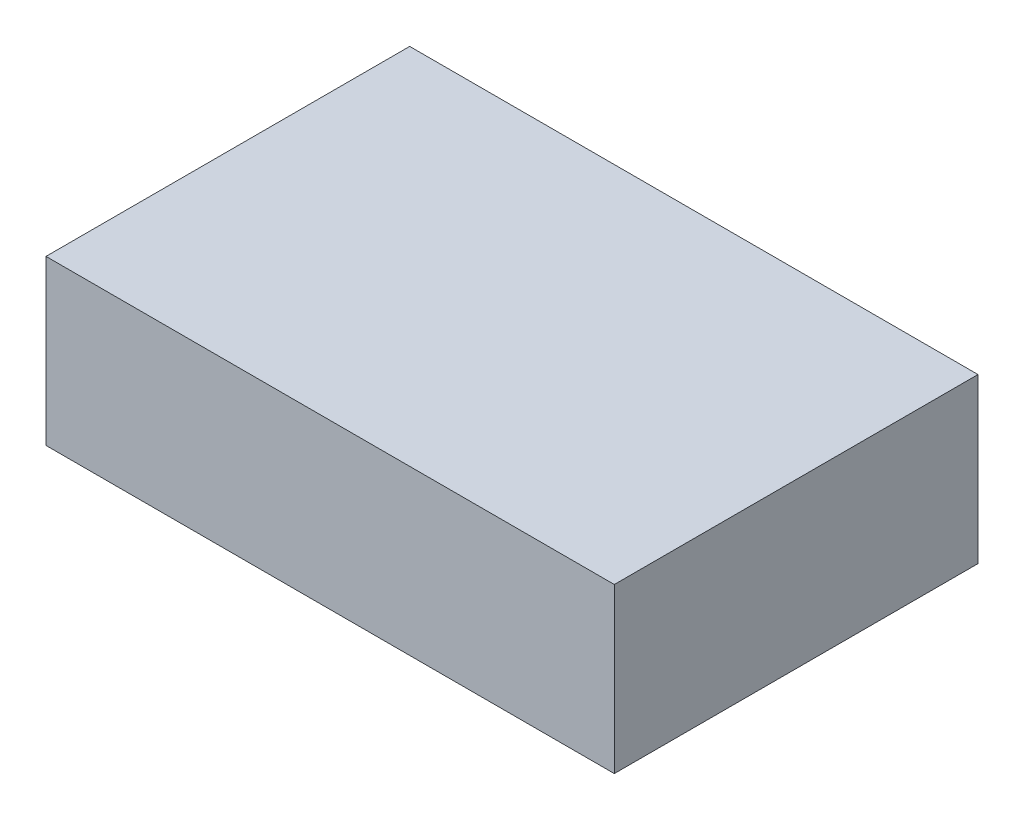
ISO-10303-21;
HEADER;
FILE_DESCRIPTION(('STEP AP214'),'2;1');
FILE_NAME('part.step','',(''),(''),'','','');
FILE_SCHEMA(('AUTOMOTIVE_DESIGN { 1 0 10303 214 1 1 1 1 }'));
ENDSEC;
DATA;
#1=APPLICATION_CONTEXT('core data for automotive mechanical design processes');
#2=APPLICATION_PROTOCOL_DEFINITION('international standard','automotive_design',2000,#1);
#3=PRODUCT_CONTEXT('',#1,'mechanical');
#4=PRODUCT('Part','Part','',(#3));
#5=PRODUCT_RELATED_PRODUCT_CATEGORY('part','',(#4));
#6=PRODUCT_DEFINITION_FORMATION('','',#4);
#7=PRODUCT_DEFINITION_CONTEXT('part definition',#1,'design');
#8=PRODUCT_DEFINITION('design','',#6,#7);
#9=PRODUCT_DEFINITION_SHAPE('','',#8);
#10=(LENGTH_UNIT() NAMED_UNIT(*) SI_UNIT(.MILLI.,.METRE.));
#11=(NAMED_UNIT(*) PLANE_ANGLE_UNIT() SI_UNIT($,.RADIAN.));
#12=(NAMED_UNIT(*) SI_UNIT($,.STERADIAN.) SOLID_ANGLE_UNIT());
#13=UNCERTAINTY_MEASURE_WITH_UNIT(LENGTH_MEASURE(1.E-05),#10,'distance_accuracy_value','');
#14=(GEOMETRIC_REPRESENTATION_CONTEXT(3) GLOBAL_UNCERTAINTY_ASSIGNED_CONTEXT((#13)) GLOBAL_UNIT_ASSIGNED_CONTEXT((#10,
#11,#12)) REPRESENTATION_CONTEXT('',''));
#15=CARTESIAN_POINT('',(0.,0.,0.));
#16=DIRECTION('',(0.,0.,1.));
#17=DIRECTION('',(1.,0.,0.));
#18=AXIS2_PLACEMENT_3D('',#15,#16,#17);
#19=CARTESIAN_POINT('',(0.,34.,0.));
#20=DIRECTION('',(1.,0.,0.));
#21=DIRECTION('',(0.,0.,-1.));
#22=AXIS2_PLACEMENT_3D('',#19,#20,#21);
#23=PLANE('',#22);
#24=DIRECTION('',(0.,0.,1.));
#25=VECTOR('',#24,1.);
#26=CARTESIAN_POINT('',(0.,0.,0.));
#27=LINE('',#26,#25);
#28=CARTESIAN_POINT('',(0.,0.,-75.5));
#29=VERTEX_POINT('',#28);
#30=CARTESIAN_POINT('',(0.,0.,0.));
#31=VERTEX_POINT('',#30);
#32=EDGE_CURVE('E106',#29,#31,#27,.T.);
#33=ORIENTED_EDGE('',*,*,#32,.T.);
#34=DIRECTION('',(0.,-1.,0.));
#35=VECTOR('',#34,1.);
#36=CARTESIAN_POINT('',(0.,34.,0.));
#37=LINE('',#36,#35);
#38=CARTESIAN_POINT('',(0.,34.,0.));
#39=VERTEX_POINT('',#38);
#40=EDGE_CURVE('E11',#39,#31,#37,.T.);
#41=ORIENTED_EDGE('',*,*,#40,.F.);
#42=DIRECTION('',(0.,0.,1.));
#43=VECTOR('',#42,1.);
#44=CARTESIAN_POINT('',(0.,34.,0.));
#45=LINE('',#44,#43);
#46=CARTESIAN_POINT('',(0.,34.,-75.5));
#47=VERTEX_POINT('',#46);
#48=EDGE_CURVE('E94',#47,#39,#45,.T.);
#49=ORIENTED_EDGE('',*,*,#48,.F.);
#50=DIRECTION('',(0.,-1.,0.));
#51=VECTOR('',#50,1.);
#52=CARTESIAN_POINT('',(0.,34.,-75.5));
#53=LINE('',#52,#51);
#54=EDGE_CURVE('E102',#47,#29,#53,.T.);
#55=ORIENTED_EDGE('',*,*,#54,.T.);
#56=EDGE_LOOP('',(#33,#41,#49,#55));
#57=FACE_BOUND('',#56,.T.);
#58=ADVANCED_FACE('F43',(#57),#23,.F.);
#59=CARTESIAN_POINT('',(0.,34.,0.));
#60=DIRECTION('',(0.,0.,-1.));
#61=DIRECTION('',(-1.,0.,0.));
#62=AXIS2_PLACEMENT_3D('',#59,#60,#61);
#63=PLANE('',#62);
#64=DIRECTION('',(1.,0.,0.));
#65=VECTOR('',#64,1.);
#66=CARTESIAN_POINT('',(0.,0.,0.));
#67=LINE('',#66,#65);
#68=CARTESIAN_POINT('',(117.983,0.,0.));
#69=VERTEX_POINT('',#68);
#70=EDGE_CURVE('E98',#31,#69,#67,.T.);
#71=ORIENTED_EDGE('',*,*,#70,.T.);
#72=DIRECTION('',(0.,-1.,0.));
#73=VECTOR('',#72,1.);
#74=CARTESIAN_POINT('',(117.983,34.,0.));
#75=LINE('',#74,#73);
#76=CARTESIAN_POINT('',(117.983,34.,0.));
#77=VERTEX_POINT('',#76);
#78=EDGE_CURVE('E51',#77,#69,#75,.T.);
#79=ORIENTED_EDGE('',*,*,#78,.F.);
#80=DIRECTION('',(1.,0.,0.));
#81=VECTOR('',#80,1.);
#82=CARTESIAN_POINT('',(0.,34.,0.));
#83=LINE('',#82,#81);
#84=EDGE_CURVE('E89',#39,#77,#83,.T.);
#85=ORIENTED_EDGE('',*,*,#84,.F.);
#86=ORIENTED_EDGE('',*,*,#40,.T.);
#87=EDGE_LOOP('',(#71,#79,#85,#86));
#88=FACE_BOUND('',#87,.T.);
#89=ADVANCED_FACE('F97',(#88),#63,.F.);
#90=CARTESIAN_POINT('',(117.983,34.,0.));
#91=DIRECTION('',(-1.,0.,0.));
#92=DIRECTION('',(0.,0.,1.));
#93=AXIS2_PLACEMENT_3D('',#90,#91,#92);
#94=PLANE('',#93);
#95=DIRECTION('',(0.,0.,-1.));
#96=VECTOR('',#95,1.);
#97=CARTESIAN_POINT('',(117.983,0.,0.));
#98=LINE('',#97,#96);
#99=CARTESIAN_POINT('',(117.983,0.,-75.5));
#100=VERTEX_POINT('',#99);
#101=EDGE_CURVE('E76',#69,#100,#98,.T.);
#102=ORIENTED_EDGE('',*,*,#101,.T.);
#103=DIRECTION('',(0.,-1.,0.));
#104=VECTOR('',#103,1.);
#105=CARTESIAN_POINT('',(117.983,34.,-75.5));
#106=LINE('',#105,#104);
#107=CARTESIAN_POINT('',(117.983,34.,-75.5));
#108=VERTEX_POINT('',#107);
#109=EDGE_CURVE('E99',#108,#100,#106,.T.);
#110=ORIENTED_EDGE('',*,*,#109,.F.);
#111=DIRECTION('',(0.,0.,-1.));
#112=VECTOR('',#111,1.);
#113=CARTESIAN_POINT('',(117.983,34.,0.));
#114=LINE('',#113,#112);
#115=EDGE_CURVE('E92',#77,#108,#114,.T.);
#116=ORIENTED_EDGE('',*,*,#115,.F.);
#117=ORIENTED_EDGE('',*,*,#78,.T.);
#118=EDGE_LOOP('',(#102,#110,#116,#117));
#119=FACE_BOUND('',#118,.T.);
#120=ADVANCED_FACE('F100',(#119),#94,.F.);
#121=CARTESIAN_POINT('',(0.,34.,-75.5));
#122=DIRECTION('',(0.,0.,1.));
#123=DIRECTION('',(1.,0.,0.));
#124=AXIS2_PLACEMENT_3D('',#121,#122,#123);
#125=PLANE('',#124);
#126=DIRECTION('',(-1.,0.,0.));
#127=VECTOR('',#126,1.);
#128=CARTESIAN_POINT('',(0.,0.,-75.5));
#129=LINE('',#128,#127);
#130=EDGE_CURVE('E82',#100,#29,#129,.T.);
#131=ORIENTED_EDGE('',*,*,#130,.T.);
#132=ORIENTED_EDGE('',*,*,#54,.F.);
#133=DIRECTION('',(-1.,0.,0.));
#134=VECTOR('',#133,1.);
#135=CARTESIAN_POINT('',(0.,34.,-75.5));
#136=LINE('',#135,#134);
#137=EDGE_CURVE('E59',#108,#47,#136,.T.);
#138=ORIENTED_EDGE('',*,*,#137,.F.);
#139=ORIENTED_EDGE('',*,*,#109,.T.);
#140=EDGE_LOOP('',(#131,#132,#138,#139));
#141=FACE_BOUND('',#140,.T.);
#142=ADVANCED_FACE('F113',(#141),#125,.F.);
#143=CARTESIAN_POINT('',(0.,34.,0.));
#144=DIRECTION('',(0.,-1.,0.));
#145=DIRECTION('',(0.,0.,-1.));
#146=AXIS2_PLACEMENT_3D('',#143,#144,#145);
#147=PLANE('',#146);
#148=ORIENTED_EDGE('',*,*,#48,.T.);
#149=ORIENTED_EDGE('',*,*,#84,.T.);
#150=ORIENTED_EDGE('',*,*,#115,.T.);
#151=ORIENTED_EDGE('',*,*,#137,.T.);
#152=EDGE_LOOP('',(#148,#149,#150,#151));
#153=FACE_BOUND('',#152,.T.);
#154=ADVANCED_FACE('F90',(#153),#147,.F.);
#155=CARTESIAN_POINT('',(0.,0.,0.));
#156=DIRECTION('',(0.,-1.,0.));
#157=DIRECTION('',(0.,0.,-1.));
#158=AXIS2_PLACEMENT_3D('',#155,#156,#157);
#159=PLANE('',#158);
#160=ORIENTED_EDGE('',*,*,#32,.F.);
#161=ORIENTED_EDGE('',*,*,#130,.F.);
#162=ORIENTED_EDGE('',*,*,#101,.F.);
#163=ORIENTED_EDGE('',*,*,#70,.F.);
#164=EDGE_LOOP('',(#160,#161,#162,#163));
#165=FACE_BOUND('',#164,.T.);
#166=ADVANCED_FACE('F116',(#165),#159,.T.);
#167=CLOSED_SHELL('',(#58,#89,#120,#142,#154,#166));
#168=MANIFOLD_SOLID_BREP('B2',#167);
#169=ADVANCED_BREP_SHAPE_REPRESENTATION('',(#18,#168),#14);
#170=SHAPE_DEFINITION_REPRESENTATION(#9,#169);
ENDSEC;
END-ISO-10303-21;
